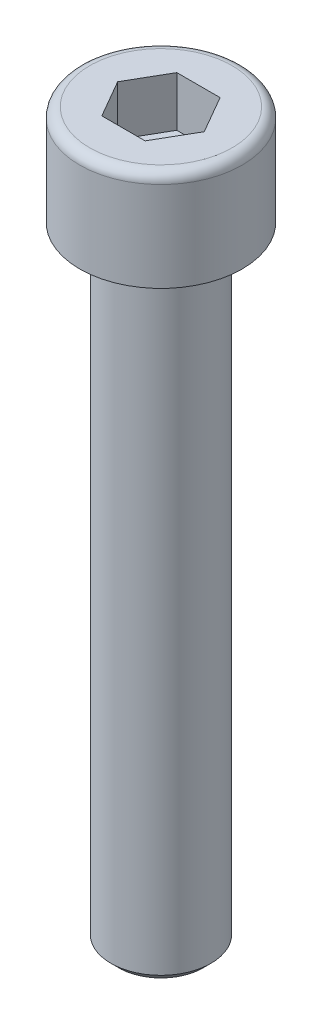
ISO-10303-21;
HEADER;
FILE_DESCRIPTION(('STEP AP214'),'2;1');
FILE_NAME('part.step','',(''),(''),'','','');
FILE_SCHEMA(('AUTOMOTIVE_DESIGN { 1 0 10303 214 1 1 1 1 }'));
ENDSEC;
DATA;
#1=APPLICATION_CONTEXT('core data for automotive mechanical design processes');
#2=APPLICATION_PROTOCOL_DEFINITION('international standard','automotive_design',2000,#1);
#3=PRODUCT_CONTEXT('',#1,'mechanical');
#4=PRODUCT('Part','Part','',(#3));
#5=PRODUCT_RELATED_PRODUCT_CATEGORY('part','',(#4));
#6=PRODUCT_DEFINITION_FORMATION('','',#4);
#7=PRODUCT_DEFINITION_CONTEXT('part definition',#1,'design');
#8=PRODUCT_DEFINITION('design','',#6,#7);
#9=PRODUCT_DEFINITION_SHAPE('','',#8);
#10=(LENGTH_UNIT() NAMED_UNIT(*) SI_UNIT(.MILLI.,.METRE.));
#11=(NAMED_UNIT(*) PLANE_ANGLE_UNIT() SI_UNIT($,.RADIAN.));
#12=(NAMED_UNIT(*) SI_UNIT($,.STERADIAN.) SOLID_ANGLE_UNIT());
#13=UNCERTAINTY_MEASURE_WITH_UNIT(LENGTH_MEASURE(1.E-05),#10,'distance_accuracy_value','');
#14=(GEOMETRIC_REPRESENTATION_CONTEXT(3) GLOBAL_UNCERTAINTY_ASSIGNED_CONTEXT((#13)) GLOBAL_UNIT_ASSIGNED_CONTEXT((#10,
#11,#12)) REPRESENTATION_CONTEXT('',''));
#15=CARTESIAN_POINT('',(0.,0.,0.));
#16=DIRECTION('',(0.,0.,1.));
#17=DIRECTION('',(1.,0.,0.));
#18=AXIS2_PLACEMENT_3D('',#15,#16,#17);
#19=CARTESIAN_POINT('',(0.,0.,0.));
#20=DIRECTION('',(0.,1.,0.));
#21=DIRECTION('',(0.,0.,1.));
#22=AXIS2_PLACEMENT_3D('',#19,#20,#21);
#23=PLANE('',#22);
#24=CARTESIAN_POINT('',(0.,0.,0.));
#25=DIRECTION('',(0.,1.,0.));
#26=DIRECTION('',(0.,0.,1.));
#27=AXIS2_PLACEMENT_3D('',#24,#25,#26);
#28=CIRCLE('',#27,5.7);
#29=CARTESIAN_POINT('',(0.,0.,5.7));
#30=VERTEX_POINT('',#29);
#31=EDGE_CURVE('E195',#30,#30,#28,.T.);
#32=ORIENTED_EDGE('',*,*,#31,.T.);
#33=EDGE_LOOP('',(#32));
#34=FACE_BOUND('',#33,.T.);
#35=DIRECTION('',(0.5,0.,-0.866025403784439));
#36=VECTOR('',#35,1.);
#37=CARTESIAN_POINT('',(1.73205080756888,0.,3.));
#38=LINE('',#37,#36);
#39=CARTESIAN_POINT('',(1.73205080756888,0.,3.));
#40=VERTEX_POINT('',#39);
#41=CARTESIAN_POINT('',(3.46410161513775,0.,0.));
#42=VERTEX_POINT('',#41);
#43=EDGE_CURVE('E74',#40,#42,#38,.T.);
#44=ORIENTED_EDGE('',*,*,#43,.F.);
#45=DIRECTION('',(1.,0.,0.));
#46=VECTOR('',#45,1.);
#47=CARTESIAN_POINT('',(-1.73205080756888,0.,3.));
#48=LINE('',#47,#46);
#49=CARTESIAN_POINT('',(-1.73205080756888,0.,3.));
#50=VERTEX_POINT('',#49);
#51=EDGE_CURVE('E168',#50,#40,#48,.T.);
#52=ORIENTED_EDGE('',*,*,#51,.F.);
#53=DIRECTION('',(0.5,0.,0.866025403784439));
#54=VECTOR('',#53,1.);
#55=CARTESIAN_POINT('',(-3.46410161513775,0.,0.));
#56=LINE('',#55,#54);
#57=CARTESIAN_POINT('',(-3.46410161513775,0.,0.));
#58=VERTEX_POINT('',#57);
#59=EDGE_CURVE('E165',#58,#50,#56,.T.);
#60=ORIENTED_EDGE('',*,*,#59,.F.);
#61=DIRECTION('',(-0.5,0.,0.866025403784439));
#62=VECTOR('',#61,1.);
#63=CARTESIAN_POINT('',(-1.73205080756888,0.,-3.));
#64=LINE('',#63,#62);
#65=CARTESIAN_POINT('',(-1.73205080756888,0.,-3.));
#66=VERTEX_POINT('',#65);
#67=EDGE_CURVE('E122',#66,#58,#64,.T.);
#68=ORIENTED_EDGE('',*,*,#67,.F.);
#69=DIRECTION('',(-1.,0.,0.));
#70=VECTOR('',#69,1.);
#71=CARTESIAN_POINT('',(1.73205080756888,0.,-3.));
#72=LINE('',#71,#70);
#73=CARTESIAN_POINT('',(1.73205080756888,0.,-3.));
#74=VERTEX_POINT('',#73);
#75=EDGE_CURVE('E159',#74,#66,#72,.T.);
#76=ORIENTED_EDGE('',*,*,#75,.F.);
#77=DIRECTION('',(-0.5,0.,-0.866025403784438));
#78=VECTOR('',#77,1.);
#79=CARTESIAN_POINT('',(3.46410161513775,0.,0.));
#80=LINE('',#79,#78);
#81=EDGE_CURVE('E155',#42,#74,#80,.T.);
#82=ORIENTED_EDGE('',*,*,#81,.F.);
#83=EDGE_LOOP('',(#44,#52,#60,#68,#76,#82));
#84=FACE_BOUND('',#83,.T.);
#85=ADVANCED_FACE('F57',(#34,#84),#23,.T.);
#86=CARTESIAN_POINT('',(0.,-63.,0.));
#87=DIRECTION('',(0.,-1.,0.));
#88=DIRECTION('',(0.,0.,-1.));
#89=AXIS2_PLACEMENT_3D('',#86,#87,#88);
#90=CYLINDRICAL_SURFACE('',#89,6.5);
#91=CARTESIAN_POINT('',(0.,-0.800000000000002,0.));
#92=DIRECTION('',(0.,1.,0.));
#93=DIRECTION('',(0.,0.,1.));
#94=AXIS2_PLACEMENT_3D('',#91,#92,#93);
#95=CIRCLE('',#94,6.5);
#96=CARTESIAN_POINT('',(0.,-0.800000000000002,6.5));
#97=VERTEX_POINT('',#96);
#98=EDGE_CURVE('E191',#97,#97,#95,.F.);
#99=ORIENTED_EDGE('',*,*,#98,.T.);
#100=EDGE_LOOP('',(#99));
#101=FACE_BOUND('',#100,.T.);
#102=CARTESIAN_POINT('',(0.,-8.,0.));
#103=DIRECTION('',(0.,-1.,0.));
#104=DIRECTION('',(0.,0.,-1.));
#105=AXIS2_PLACEMENT_3D('',#102,#103,#104);
#106=CIRCLE('',#105,6.5);
#107=CARTESIAN_POINT('',(0.,-8.,-6.5));
#108=VERTEX_POINT('',#107);
#109=EDGE_CURVE('E187',#108,#108,#106,.T.);
#110=ORIENTED_EDGE('',*,*,#109,.F.);
#111=EDGE_LOOP('',(#110));
#112=FACE_BOUND('',#111,.T.);
#113=ADVANCED_FACE('F216',(#101,#112),#90,.T.);
#114=CARTESIAN_POINT('',(6.5,-8.,0.));
#115=DIRECTION('',(0.,-1.,0.));
#116=DIRECTION('',(0.,0.,-1.));
#117=AXIS2_PLACEMENT_3D('',#114,#115,#116);
#118=PLANE('',#117);
#119=ORIENTED_EDGE('',*,*,#109,.T.);
#120=EDGE_LOOP('',(#119));
#121=FACE_BOUND('',#120,.T.);
#122=CARTESIAN_POINT('',(0.,-8.,0.));
#123=DIRECTION('',(0.,-1.,0.));
#124=DIRECTION('',(0.,0.,-1.));
#125=AXIS2_PLACEMENT_3D('',#122,#123,#124);
#126=CIRCLE('',#125,4.);
#127=CARTESIAN_POINT('',(0.,-8.,-4.));
#128=VERTEX_POINT('',#127);
#129=EDGE_CURVE('E174',#128,#128,#126,.T.);
#130=ORIENTED_EDGE('',*,*,#129,.F.);
#131=EDGE_LOOP('',(#130));
#132=FACE_BOUND('',#131,.T.);
#133=ADVANCED_FACE('F223',(#121,#132),#118,.T.);
#134=CARTESIAN_POINT('',(0.,-63.,0.));
#135=DIRECTION('',(0.,-1.,0.));
#136=DIRECTION('',(0.,0.,-1.));
#137=AXIS2_PLACEMENT_3D('',#134,#135,#136);
#138=CYLINDRICAL_SURFACE('',#137,4.00000000000001);
#139=CARTESIAN_POINT('',(0.,-57.375,0.));
#140=DIRECTION('',(0.,-1.,0.));
#141=DIRECTION('',(0.,0.,-1.));
#142=AXIS2_PLACEMENT_3D('',#139,#140,#141);
#143=CIRCLE('',#142,4.00000000000001);
#144=CARTESIAN_POINT('',(0.,-57.375,-4.00000000000001));
#145=VERTEX_POINT('',#144);
#146=EDGE_CURVE('E11',#145,#145,#143,.F.);
#147=ORIENTED_EDGE('',*,*,#146,.T.);
#148=EDGE_LOOP('',(#147));
#149=FACE_BOUND('',#148,.T.);
#150=ORIENTED_EDGE('',*,*,#129,.T.);
#151=EDGE_LOOP('',(#150));
#152=FACE_BOUND('',#151,.T.);
#153=ADVANCED_FACE('F230',(#149,#152),#138,.T.);
#154=CARTESIAN_POINT('',(4.00000000000001,-58.,0.));
#155=DIRECTION('',(0.,-1.,0.));
#156=DIRECTION('',(0.,0.,-1.));
#157=AXIS2_PLACEMENT_3D('',#154,#155,#156);
#158=PLANE('',#157);
#159=CARTESIAN_POINT('',(0.,-58.,0.));
#160=DIRECTION('',(0.,-1.,0.));
#161=DIRECTION('',(0.,0.,-1.));
#162=AXIS2_PLACEMENT_3D('',#159,#160,#161);
#163=CIRCLE('',#162,3.375);
#164=CARTESIAN_POINT('',(0.,-58.,-3.375));
#165=VERTEX_POINT('',#164);
#166=EDGE_CURVE('E67',#165,#165,#163,.T.);
#167=ORIENTED_EDGE('',*,*,#166,.T.);
#168=EDGE_LOOP('',(#167));
#169=FACE_BOUND('',#168,.T.);
#170=ADVANCED_FACE('F203',(#169),#158,.T.);
#171=CARTESIAN_POINT('',(1.73205080756888,-4.,3.));
#172=DIRECTION('',(0.866025403784439,0.,0.5));
#173=DIRECTION('',(0.5,0.,-0.866025403784439));
#174=AXIS2_PLACEMENT_3D('',#171,#172,#173);
#175=PLANE('',#174);
#176=ORIENTED_EDGE('',*,*,#43,.T.);
#177=DIRECTION('',(0.,1.,0.));
#178=VECTOR('',#177,1.);
#179=CARTESIAN_POINT('',(3.46410161513775,-4.,0.));
#180=LINE('',#179,#178);
#181=CARTESIAN_POINT('',(3.46410161513775,-4.,0.));
#182=VERTEX_POINT('',#181);
#183=EDGE_CURVE('E104',#182,#42,#180,.T.);
#184=ORIENTED_EDGE('',*,*,#183,.F.);
#185=DIRECTION('',(0.5,0.,-0.866025403784439));
#186=VECTOR('',#185,1.);
#187=CARTESIAN_POINT('',(1.73205080756888,-4.,3.));
#188=LINE('',#187,#186);
#189=CARTESIAN_POINT('',(1.73205080756888,-4.,3.));
#190=VERTEX_POINT('',#189);
#191=EDGE_CURVE('E171',#190,#182,#188,.T.);
#192=ORIENTED_EDGE('',*,*,#191,.F.);
#193=DIRECTION('',(0.,1.,0.));
#194=VECTOR('',#193,1.);
#195=CARTESIAN_POINT('',(1.73205080756888,-4.,3.));
#196=LINE('',#195,#194);
#197=EDGE_CURVE('E82',#190,#40,#196,.T.);
#198=ORIENTED_EDGE('',*,*,#197,.T.);
#199=EDGE_LOOP('',(#176,#184,#192,#198));
#200=FACE_BOUND('',#199,.T.);
#201=ADVANCED_FACE('F236',(#200),#175,.F.);
#202=CARTESIAN_POINT('',(-1.73205080756888,-4.,3.));
#203=DIRECTION('',(0.,0.,1.));
#204=DIRECTION('',(1.,0.,0.));
#205=AXIS2_PLACEMENT_3D('',#202,#203,#204);
#206=PLANE('',#205);
#207=ORIENTED_EDGE('',*,*,#51,.T.);
#208=ORIENTED_EDGE('',*,*,#197,.F.);
#209=DIRECTION('',(1.,0.,0.));
#210=VECTOR('',#209,1.);
#211=CARTESIAN_POINT('',(-1.73205080756888,-4.,3.));
#212=LINE('',#211,#210);
#213=CARTESIAN_POINT('',(-1.73205080756888,-4.,3.));
#214=VERTEX_POINT('',#213);
#215=EDGE_CURVE('E136',#214,#190,#212,.T.);
#216=ORIENTED_EDGE('',*,*,#215,.F.);
#217=DIRECTION('',(0.,1.,0.));
#218=VECTOR('',#217,1.);
#219=CARTESIAN_POINT('',(-1.73205080756888,-4.,3.));
#220=LINE('',#219,#218);
#221=EDGE_CURVE('E127',#214,#50,#220,.T.);
#222=ORIENTED_EDGE('',*,*,#221,.T.);
#223=EDGE_LOOP('',(#207,#208,#216,#222));
#224=FACE_BOUND('',#223,.T.);
#225=ADVANCED_FACE('F239',(#224),#206,.F.);
#226=CARTESIAN_POINT('',(-3.46410161513775,-4.,0.));
#227=DIRECTION('',(-0.866025403784439,0.,0.5));
#228=DIRECTION('',(0.5,0.,0.866025403784439));
#229=AXIS2_PLACEMENT_3D('',#226,#227,#228);
#230=PLANE('',#229);
#231=ORIENTED_EDGE('',*,*,#59,.T.);
#232=ORIENTED_EDGE('',*,*,#221,.F.);
#233=DIRECTION('',(0.5,0.,0.866025403784439));
#234=VECTOR('',#233,1.);
#235=CARTESIAN_POINT('',(-3.46410161513775,-4.,0.));
#236=LINE('',#235,#234);
#237=CARTESIAN_POINT('',(-3.46410161513775,-4.,0.));
#238=VERTEX_POINT('',#237);
#239=EDGE_CURVE('E131',#238,#214,#236,.T.);
#240=ORIENTED_EDGE('',*,*,#239,.F.);
#241=DIRECTION('',(0.,1.,0.));
#242=VECTOR('',#241,1.);
#243=CARTESIAN_POINT('',(-3.46410161513775,-4.,0.));
#244=LINE('',#243,#242);
#245=EDGE_CURVE('E115',#238,#58,#244,.T.);
#246=ORIENTED_EDGE('',*,*,#245,.T.);
#247=EDGE_LOOP('',(#231,#232,#240,#246));
#248=FACE_BOUND('',#247,.T.);
#249=ADVANCED_FACE('F132',(#248),#230,.F.);
#250=CARTESIAN_POINT('',(-1.73205080756888,-4.,-3.));
#251=DIRECTION('',(-0.866025403784439,0.,-0.5));
#252=DIRECTION('',(-0.5,0.,0.866025403784439));
#253=AXIS2_PLACEMENT_3D('',#250,#251,#252);
#254=PLANE('',#253);
#255=ORIENTED_EDGE('',*,*,#67,.T.);
#256=ORIENTED_EDGE('',*,*,#245,.F.);
#257=DIRECTION('',(-0.5,0.,0.866025403784439));
#258=VECTOR('',#257,1.);
#259=CARTESIAN_POINT('',(-1.73205080756888,-4.,-3.));
#260=LINE('',#259,#258);
#261=CARTESIAN_POINT('',(-1.73205080756888,-4.,-3.));
#262=VERTEX_POINT('',#261);
#263=EDGE_CURVE('E119',#262,#238,#260,.T.);
#264=ORIENTED_EDGE('',*,*,#263,.F.);
#265=DIRECTION('',(0.,1.,0.));
#266=VECTOR('',#265,1.);
#267=CARTESIAN_POINT('',(-1.73205080756888,-4.,-3.));
#268=LINE('',#267,#266);
#269=EDGE_CURVE('E128',#262,#66,#268,.T.);
#270=ORIENTED_EDGE('',*,*,#269,.T.);
#271=EDGE_LOOP('',(#255,#256,#264,#270));
#272=FACE_BOUND('',#271,.T.);
#273=ADVANCED_FACE('F117',(#272),#254,.F.);
#274=CARTESIAN_POINT('',(1.73205080756888,-4.,-3.));
#275=DIRECTION('',(0.,0.,-1.));
#276=DIRECTION('',(-1.,0.,0.));
#277=AXIS2_PLACEMENT_3D('',#274,#275,#276);
#278=PLANE('',#277);
#279=ORIENTED_EDGE('',*,*,#75,.T.);
#280=ORIENTED_EDGE('',*,*,#269,.F.);
#281=DIRECTION('',(-1.,0.,0.));
#282=VECTOR('',#281,1.);
#283=CARTESIAN_POINT('',(1.73205080756888,-4.,-3.));
#284=LINE('',#283,#282);
#285=CARTESIAN_POINT('',(1.73205080756888,-4.,-3.));
#286=VERTEX_POINT('',#285);
#287=EDGE_CURVE('E142',#286,#262,#284,.T.);
#288=ORIENTED_EDGE('',*,*,#287,.F.);
#289=DIRECTION('',(0.,1.,0.));
#290=VECTOR('',#289,1.);
#291=CARTESIAN_POINT('',(1.73205080756888,-4.,-3.));
#292=LINE('',#291,#290);
#293=EDGE_CURVE('E179',#286,#74,#292,.T.);
#294=ORIENTED_EDGE('',*,*,#293,.T.);
#295=EDGE_LOOP('',(#279,#280,#288,#294));
#296=FACE_BOUND('',#295,.T.);
#297=ADVANCED_FACE('F243',(#296),#278,.F.);
#298=CARTESIAN_POINT('',(3.46410161513775,-4.,0.));
#299=DIRECTION('',(0.866025403784439,0.,-0.5));
#300=DIRECTION('',(-0.5,0.,-0.866025403784439));
#301=AXIS2_PLACEMENT_3D('',#298,#299,#300);
#302=PLANE('',#301);
#303=ORIENTED_EDGE('',*,*,#81,.T.);
#304=ORIENTED_EDGE('',*,*,#293,.F.);
#305=DIRECTION('',(-0.5,0.,-0.866025403784438));
#306=VECTOR('',#305,1.);
#307=CARTESIAN_POINT('',(3.46410161513775,-4.,0.));
#308=LINE('',#307,#306);
#309=EDGE_CURVE('E147',#182,#286,#308,.T.);
#310=ORIENTED_EDGE('',*,*,#309,.F.);
#311=ORIENTED_EDGE('',*,*,#183,.T.);
#312=EDGE_LOOP('',(#303,#304,#310,#311));
#313=FACE_BOUND('',#312,.T.);
#314=ADVANCED_FACE('F240',(#313),#302,.F.);
#315=CARTESIAN_POINT('',(0.,-4.,0.));
#316=DIRECTION('',(0.,1.,0.));
#317=DIRECTION('',(0.,0.,1.));
#318=AXIS2_PLACEMENT_3D('',#315,#316,#317);
#319=PLANE('',#318);
#320=ORIENTED_EDGE('',*,*,#191,.T.);
#321=ORIENTED_EDGE('',*,*,#309,.T.);
#322=ORIENTED_EDGE('',*,*,#287,.T.);
#323=ORIENTED_EDGE('',*,*,#263,.T.);
#324=ORIENTED_EDGE('',*,*,#239,.T.);
#325=ORIENTED_EDGE('',*,*,#215,.T.);
#326=EDGE_LOOP('',(#320,#321,#322,#323,#324,#325));
#327=FACE_BOUND('',#326,.T.);
#328=ADVANCED_FACE('F139',(#327),#319,.T.);
#329=CARTESIAN_POINT('',(0.,-0.800000000000002,0.));
#330=DIRECTION('',(0.,1.,0.));
#331=DIRECTION('',(0.,0.,1.));
#332=AXIS2_PLACEMENT_3D('',#329,#330,#331);
#333=TOROIDAL_SURFACE('',#332,5.7,0.8);
#334=ORIENTED_EDGE('',*,*,#31,.F.);
#335=EDGE_LOOP('',(#334));
#336=FACE_BOUND('',#335,.T.);
#337=ORIENTED_EDGE('',*,*,#98,.F.);
#338=EDGE_LOOP('',(#337));
#339=FACE_BOUND('',#338,.T.);
#340=ADVANCED_FACE('F206',(#336,#339),#333,.T.);
#341=CARTESIAN_POINT('',(0.,-58.,0.));
#342=DIRECTION('',(0.,1.,0.));
#343=DIRECTION('',(0.,0.,1.));
#344=AXIS2_PLACEMENT_3D('',#341,#342,#343);
#345=CONICAL_SURFACE('',#344,3.375,0.785398163397444);
#346=ORIENTED_EDGE('',*,*,#146,.F.);
#347=EDGE_LOOP('',(#346));
#348=FACE_BOUND('',#347,.T.);
#349=ORIENTED_EDGE('',*,*,#166,.F.);
#350=EDGE_LOOP('',(#349));
#351=FACE_BOUND('',#350,.T.);
#352=ADVANCED_FACE('F60',(#348,#351),#345,.T.);
#353=CLOSED_SHELL('',(#85,#113,#133,#153,#170,#201,#225,#249,#273,#297,#314,#328,#340,#352));
#354=MANIFOLD_SOLID_BREP('B2',#353);
#355=ADVANCED_BREP_SHAPE_REPRESENTATION('',(#18,#354),#14);
#356=SHAPE_DEFINITION_REPRESENTATION(#9,#355);
ENDSEC;
END-ISO-10303-21;
